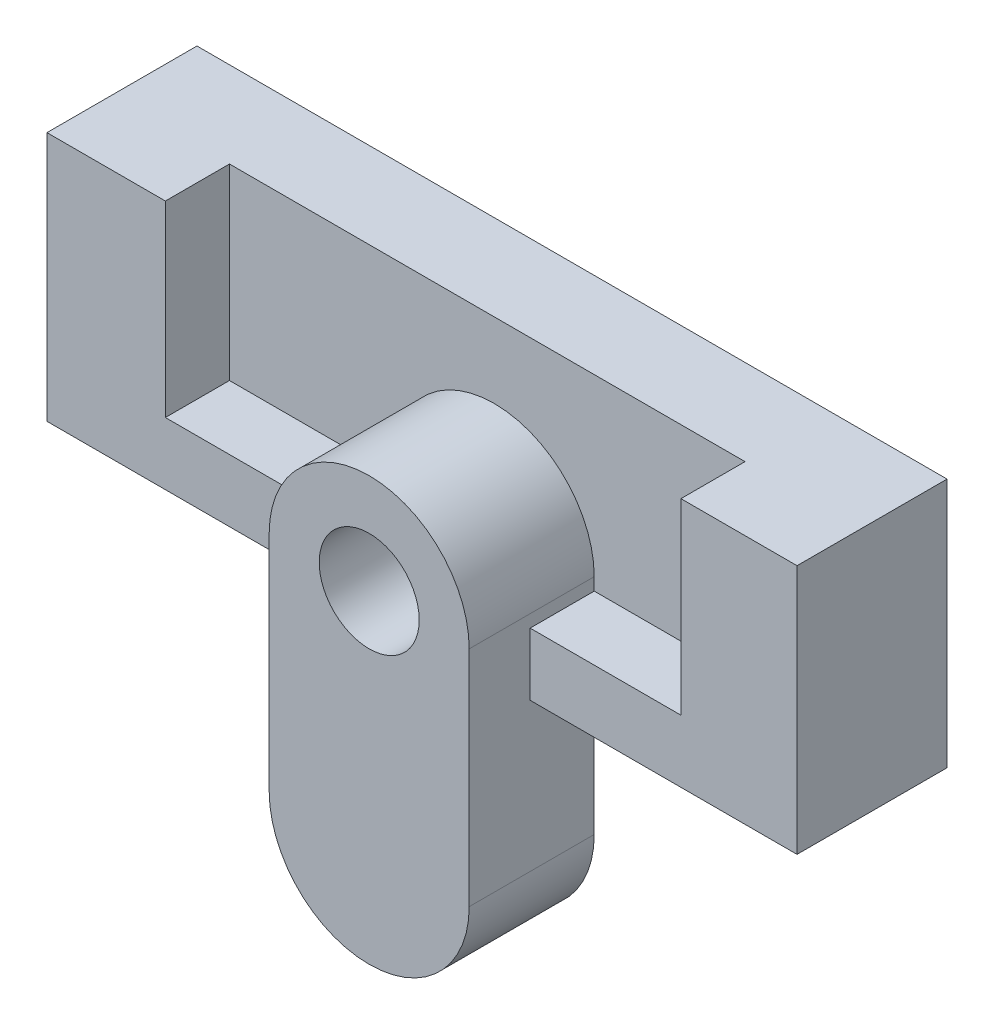
ISO-10303-21;
HEADER;
FILE_DESCRIPTION(('STEP AP214'),'2;1');
FILE_NAME('part.step','',(''),(''),'','','');
FILE_SCHEMA(('AUTOMOTIVE_DESIGN { 1 0 10303 214 1 1 1 1 }'));
ENDSEC;
DATA;
#1=APPLICATION_CONTEXT('core data for automotive mechanical design processes');
#2=APPLICATION_PROTOCOL_DEFINITION('international standard','automotive_design',2000,#1);
#3=PRODUCT_CONTEXT('',#1,'mechanical');
#4=PRODUCT('Part','Part','',(#3));
#5=PRODUCT_RELATED_PRODUCT_CATEGORY('part','',(#4));
#6=PRODUCT_DEFINITION_FORMATION('','',#4);
#7=PRODUCT_DEFINITION_CONTEXT('part definition',#1,'design');
#8=PRODUCT_DEFINITION('design','',#6,#7);
#9=PRODUCT_DEFINITION_SHAPE('','',#8);
#10=(LENGTH_UNIT() NAMED_UNIT(*) SI_UNIT(.MILLI.,.METRE.));
#11=(NAMED_UNIT(*) PLANE_ANGLE_UNIT() SI_UNIT($,.RADIAN.));
#12=(NAMED_UNIT(*) SI_UNIT($,.STERADIAN.) SOLID_ANGLE_UNIT());
#13=UNCERTAINTY_MEASURE_WITH_UNIT(LENGTH_MEASURE(1.E-05),#10,'distance_accuracy_value','');
#14=(GEOMETRIC_REPRESENTATION_CONTEXT(3) GLOBAL_UNCERTAINTY_ASSIGNED_CONTEXT((#13)) GLOBAL_UNIT_ASSIGNED_CONTEXT((#10,
#11,#12)) REPRESENTATION_CONTEXT('',''));
#15=CARTESIAN_POINT('',(0.,0.,0.));
#16=DIRECTION('',(0.,0.,1.));
#17=DIRECTION('',(1.,0.,0.));
#18=AXIS2_PLACEMENT_3D('',#15,#16,#17);
#19=CARTESIAN_POINT('',(-21.1764705882353,20.,-5.8513931888545));
#20=DIRECTION('',(0.,0.,-1.));
#21=DIRECTION('',(-1.,0.,0.));
#22=AXIS2_PLACEMENT_3D('',#19,#20,#21);
#23=PLANE('',#22);
#24=CARTESIAN_POINT('',(0.,6.,-5.8513931888545));
#25=DIRECTION('',(0.,0.,1.));
#26=DIRECTION('',(1.,0.,0.));
#27=AXIS2_PLACEMENT_3D('',#24,#25,#26);
#28=CIRCLE('',#27,8.);
#29=CARTESIAN_POINT('',(8.,6.,-5.8513931888545));
#30=VERTEX_POINT('',#29);
#31=CARTESIAN_POINT('',(-8.,6.,-5.8513931888545));
#32=VERTEX_POINT('',#31);
#33=EDGE_CURVE('E48',#30,#32,#28,.T.);
#34=ORIENTED_EDGE('',*,*,#33,.F.);
#35=DIRECTION('',(0.,-1.,0.));
#36=VECTOR('',#35,1.);
#37=CARTESIAN_POINT('',(8.,0.,-5.8513931888545));
#38=LINE('',#37,#36);
#39=CARTESIAN_POINT('',(8.,5.,-5.8513931888545));
#40=VERTEX_POINT('',#39);
#41=EDGE_CURVE('E152',#30,#40,#38,.T.);
#42=ORIENTED_EDGE('',*,*,#41,.T.);
#43=DIRECTION('',(-1.,0.,0.));
#44=VECTOR('',#43,1.);
#45=CARTESIAN_POINT('',(-21.1764705882353,5.,-5.8513931888545));
#46=LINE('',#45,#44);
#47=CARTESIAN_POINT('',(20.0619195046439,5.,-5.8513931888545));
#48=VERTEX_POINT('',#47);
#49=EDGE_CURVE('E211',#48,#40,#46,.T.);
#50=ORIENTED_EDGE('',*,*,#49,.F.);
#51=DIRECTION('',(0.,-1.,0.));
#52=VECTOR('',#51,1.);
#53=CARTESIAN_POINT('',(20.0619195046439,20.,-5.8513931888545));
#54=LINE('',#53,#52);
#55=CARTESIAN_POINT('',(20.0619195046439,20.,-5.8513931888545));
#56=VERTEX_POINT('',#55);
#57=EDGE_CURVE('E259',#56,#48,#54,.T.);
#58=ORIENTED_EDGE('',*,*,#57,.F.);
#59=DIRECTION('',(1.,0.,0.));
#60=VECTOR('',#59,1.);
#61=CARTESIAN_POINT('',(-21.1764705882353,20.,-5.8513931888545));
#62=LINE('',#61,#60);
#63=CARTESIAN_POINT('',(-21.1764705882353,20.,-5.8513931888545));
#64=VERTEX_POINT('',#63);
#65=EDGE_CURVE('E229',#64,#56,#62,.T.);
#66=ORIENTED_EDGE('',*,*,#65,.F.);
#67=DIRECTION('',(0.,-1.,0.));
#68=VECTOR('',#67,1.);
#69=CARTESIAN_POINT('',(-21.1764705882353,20.,-5.8513931888545));
#70=LINE('',#69,#68);
#71=CARTESIAN_POINT('',(-21.1764705882353,5.,-5.8513931888545));
#72=VERTEX_POINT('',#71);
#73=EDGE_CURVE('E256',#64,#72,#70,.T.);
#74=ORIENTED_EDGE('',*,*,#73,.T.);
#75=CARTESIAN_POINT('',(-8.,5.,-5.8513931888545));
#76=VERTEX_POINT('',#75);
#77=EDGE_CURVE('E210',#76,#72,#46,.T.);
#78=ORIENTED_EDGE('',*,*,#77,.F.);
#79=DIRECTION('',(0.,-1.,0.));
#80=VECTOR('',#79,1.);
#81=CARTESIAN_POINT('',(-8.,0.,-5.8513931888545));
#82=LINE('',#81,#80);
#83=EDGE_CURVE('E53',#32,#76,#82,.T.);
#84=ORIENTED_EDGE('',*,*,#83,.F.);
#85=EDGE_LOOP('',(#34,#42,#50,#58,#66,#74,#78,#84));
#86=FACE_BOUND('',#85,.T.);
#87=ADVANCED_FACE('F33',(#86),#23,.F.);
#88=CARTESIAN_POINT('',(-30.6501547987616,20.,-0.724458204334357));
#89=DIRECTION('',(0.,0.,-1.));
#90=DIRECTION('',(-1.,0.,0.));
#91=AXIS2_PLACEMENT_3D('',#88,#89,#90);
#92=PLANE('',#91);
#93=DIRECTION('',(1.,0.,0.));
#94=VECTOR('',#93,1.);
#95=CARTESIAN_POINT('',(-30.6501547987616,5.,-0.724458204334357));
#96=LINE('',#95,#94);
#97=CARTESIAN_POINT('',(7.99999999999998,5.,-0.724458204334357));
#98=VERTEX_POINT('',#97);
#99=CARTESIAN_POINT('',(20.0619195046439,5.,-0.724458204334357));
#100=VERTEX_POINT('',#99);
#101=EDGE_CURVE('E204',#98,#100,#96,.T.);
#102=ORIENTED_EDGE('',*,*,#101,.F.);
#103=DIRECTION('',(0.,-1.,0.));
#104=VECTOR('',#103,1.);
#105=CARTESIAN_POINT('',(8.,20.,-0.724458204334357));
#106=LINE('',#105,#104);
#107=CARTESIAN_POINT('',(7.99999999999998,0.,-0.724458204334357));
#108=VERTEX_POINT('',#107);
#109=EDGE_CURVE('E199',#98,#108,#106,.T.);
#110=ORIENTED_EDGE('',*,*,#109,.T.);
#111=DIRECTION('',(1.,0.,0.));
#112=VECTOR('',#111,1.);
#113=CARTESIAN_POINT('',(-30.6501547987616,0.,-0.724458204334357));
#114=LINE('',#113,#112);
#115=CARTESIAN_POINT('',(29.3498452012384,0.,-0.724458204334357));
#116=VERTEX_POINT('',#115);
#117=EDGE_CURVE('E243',#108,#116,#114,.T.);
#118=ORIENTED_EDGE('',*,*,#117,.T.);
#119=DIRECTION('',(0.,-1.,0.));
#120=VECTOR('',#119,1.);
#121=CARTESIAN_POINT('',(29.3498452012384,20.,-0.724458204334357));
#122=LINE('',#121,#120);
#123=CARTESIAN_POINT('',(29.3498452012384,20.,-0.724458204334357));
#124=VERTEX_POINT('',#123);
#125=EDGE_CURVE('E265',#124,#116,#122,.T.);
#126=ORIENTED_EDGE('',*,*,#125,.F.);
#127=DIRECTION('',(1.,0.,0.));
#128=VECTOR('',#127,1.);
#129=CARTESIAN_POINT('',(20.0619195046439,20.,-0.724458204334357));
#130=LINE('',#129,#128);
#131=CARTESIAN_POINT('',(20.0619195046439,20.,-0.724458204334357));
#132=VERTEX_POINT('',#131);
#133=EDGE_CURVE('E224',#132,#124,#130,.T.);
#134=ORIENTED_EDGE('',*,*,#133,.F.);
#135=DIRECTION('',(0.,-1.,0.));
#136=VECTOR('',#135,1.);
#137=CARTESIAN_POINT('',(20.0619195046439,20.,-0.724458204334357));
#138=LINE('',#137,#136);
#139=EDGE_CURVE('E262',#132,#100,#138,.T.);
#140=ORIENTED_EDGE('',*,*,#139,.T.);
#141=EDGE_LOOP('',(#102,#110,#118,#126,#134,#140));
#142=FACE_BOUND('',#141,.T.);
#143=ADVANCED_FACE('F321',(#142),#92,.F.);
#144=CARTESIAN_POINT('',(0.,5.,0.));
#145=DIRECTION('',(0.,-1.,0.));
#146=DIRECTION('',(0.,0.,-1.));
#147=AXIS2_PLACEMENT_3D('',#144,#145,#146);
#148=PLANE('',#147);
#149=DIRECTION('',(0.,0.,1.));
#150=VECTOR('',#149,1.);
#151=CARTESIAN_POINT('',(-8.,5.,0.));
#152=LINE('',#151,#150);
#153=CARTESIAN_POINT('',(-8.,5.,-0.724458204334357));
#154=VERTEX_POINT('',#153);
#155=EDGE_CURVE('E41',#76,#154,#152,.T.);
#156=ORIENTED_EDGE('',*,*,#155,.F.);
#157=ORIENTED_EDGE('',*,*,#77,.T.);
#158=DIRECTION('',(0.,0.,1.));
#159=VECTOR('',#158,1.);
#160=CARTESIAN_POINT('',(-21.1764705882353,5.,-0.724458204334357));
#161=LINE('',#160,#159);
#162=CARTESIAN_POINT('',(-21.1764705882353,5.,-0.724458204334357));
#163=VERTEX_POINT('',#162);
#164=EDGE_CURVE('E214',#72,#163,#161,.T.);
#165=ORIENTED_EDGE('',*,*,#164,.T.);
#166=EDGE_CURVE('E205',#163,#154,#96,.T.);
#167=ORIENTED_EDGE('',*,*,#166,.T.);
#168=EDGE_LOOP('',(#156,#157,#165,#167));
#169=FACE_BOUND('',#168,.T.);
#170=ADVANCED_FACE('F274',(#169),#148,.F.);
#171=ORIENTED_EDGE('',*,*,#49,.T.);
#172=DIRECTION('',(0.,0.,1.));
#173=VECTOR('',#172,1.);
#174=CARTESIAN_POINT('',(8.,5.,0.));
#175=LINE('',#174,#173);
#176=EDGE_CURVE('E11',#40,#98,#175,.T.);
#177=ORIENTED_EDGE('',*,*,#176,.T.);
#178=ORIENTED_EDGE('',*,*,#101,.T.);
#179=DIRECTION('',(0.,0.,1.));
#180=VECTOR('',#179,1.);
#181=CARTESIAN_POINT('',(20.0619195046439,5.,-0.724458204334357));
#182=LINE('',#181,#180);
#183=EDGE_CURVE('E207',#48,#100,#182,.T.);
#184=ORIENTED_EDGE('',*,*,#183,.F.);
#185=EDGE_LOOP('',(#171,#177,#178,#184));
#186=FACE_BOUND('',#185,.T.);
#187=ADVANCED_FACE('F353',(#186),#148,.F.);
#188=CARTESIAN_POINT('',(-21.1764705882353,20.,-0.724458204334357));
#189=DIRECTION('',(-1.,0.,0.));
#190=DIRECTION('',(0.,0.,1.));
#191=AXIS2_PLACEMENT_3D('',#188,#189,#190);
#192=PLANE('',#191);
#193=ORIENTED_EDGE('',*,*,#164,.F.);
#194=ORIENTED_EDGE('',*,*,#73,.F.);
#195=DIRECTION('',(0.,0.,-1.));
#196=VECTOR('',#195,1.);
#197=CARTESIAN_POINT('',(-21.1764705882353,20.,-0.724458204334357));
#198=LINE('',#197,#196);
#199=CARTESIAN_POINT('',(-21.1764705882353,20.,-0.724458204334357));
#200=VERTEX_POINT('',#199);
#201=EDGE_CURVE('E231',#200,#64,#198,.T.);
#202=ORIENTED_EDGE('',*,*,#201,.F.);
#203=DIRECTION('',(0.,-1.,0.));
#204=VECTOR('',#203,1.);
#205=CARTESIAN_POINT('',(-21.1764705882353,20.,-0.724458204334357));
#206=LINE('',#205,#204);
#207=EDGE_CURVE('E253',#200,#163,#206,.T.);
#208=ORIENTED_EDGE('',*,*,#207,.T.);
#209=EDGE_LOOP('',(#193,#194,#202,#208));
#210=FACE_BOUND('',#209,.T.);
#211=ADVANCED_FACE('F282',(#210),#192,.F.);
#212=CARTESIAN_POINT('',(20.0619195046439,20.,-0.724458204334357));
#213=DIRECTION('',(-1.,0.,0.));
#214=DIRECTION('',(0.,0.,1.));
#215=AXIS2_PLACEMENT_3D('',#212,#213,#214);
#216=PLANE('',#215);
#217=ORIENTED_EDGE('',*,*,#57,.T.);
#218=ORIENTED_EDGE('',*,*,#183,.T.);
#219=ORIENTED_EDGE('',*,*,#139,.F.);
#220=DIRECTION('',(0.,0.,-1.));
#221=VECTOR('',#220,1.);
#222=CARTESIAN_POINT('',(20.0619195046439,20.,-0.724458204334357));
#223=LINE('',#222,#221);
#224=EDGE_CURVE('E226',#132,#56,#223,.T.);
#225=ORIENTED_EDGE('',*,*,#224,.T.);
#226=EDGE_LOOP('',(#217,#218,#219,#225));
#227=FACE_BOUND('',#226,.T.);
#228=ADVANCED_FACE('F330',(#227),#216,.T.);
#229=CARTESIAN_POINT('',(-30.6501547987616,20.,-12.7244582043344));
#230=DIRECTION('',(0.,0.,-1.));
#231=DIRECTION('',(-1.,0.,0.));
#232=AXIS2_PLACEMENT_3D('',#229,#230,#231);
#233=PLANE('',#232);
#234=CARTESIAN_POINT('',(0.,6.,-12.7244582043344));
#235=DIRECTION('',(0.,0.,1.));
#236=DIRECTION('',(1.,0.,0.));
#237=AXIS2_PLACEMENT_3D('',#234,#235,#236);
#238=CIRCLE('',#237,4.);
#239=CARTESIAN_POINT('',(4.,6.,-12.7244582043344));
#240=VERTEX_POINT('',#239);
#241=EDGE_CURVE('E175',#240,#240,#238,.T.);
#242=ORIENTED_EDGE('',*,*,#241,.T.);
#243=EDGE_LOOP('',(#242));
#244=FACE_BOUND('',#243,.T.);
#245=DIRECTION('',(1.,0.,0.));
#246=VECTOR('',#245,1.);
#247=CARTESIAN_POINT('',(-30.6501547987616,0.,-12.7244582043344));
#248=LINE('',#247,#246);
#249=CARTESIAN_POINT('',(-30.6501547987616,0.,-12.7244582043344));
#250=VERTEX_POINT('',#249);
#251=CARTESIAN_POINT('',(29.3498452012384,0.,-12.7244582043344));
#252=VERTEX_POINT('',#251);
#253=EDGE_CURVE('E216',#250,#252,#248,.T.);
#254=ORIENTED_EDGE('',*,*,#253,.F.);
#255=DIRECTION('',(0.,-1.,0.));
#256=VECTOR('',#255,1.);
#257=CARTESIAN_POINT('',(-30.6501547987616,20.,-12.7244582043344));
#258=LINE('',#257,#256);
#259=CARTESIAN_POINT('',(-30.6501547987616,20.,-12.7244582043344));
#260=VERTEX_POINT('',#259);
#261=EDGE_CURVE('E249',#260,#250,#258,.T.);
#262=ORIENTED_EDGE('',*,*,#261,.F.);
#263=DIRECTION('',(1.,0.,0.));
#264=VECTOR('',#263,1.);
#265=CARTESIAN_POINT('',(-30.6501547987616,20.,-12.7244582043344));
#266=LINE('',#265,#264);
#267=CARTESIAN_POINT('',(29.3498452012384,20.,-12.7244582043344));
#268=VERTEX_POINT('',#267);
#269=EDGE_CURVE('E217',#260,#268,#266,.T.);
#270=ORIENTED_EDGE('',*,*,#269,.T.);
#271=DIRECTION('',(0.,-1.,0.));
#272=VECTOR('',#271,1.);
#273=CARTESIAN_POINT('',(29.3498452012384,20.,-12.7244582043344));
#274=LINE('',#273,#272);
#275=EDGE_CURVE('E237',#268,#252,#274,.T.);
#276=ORIENTED_EDGE('',*,*,#275,.T.);
#277=EDGE_LOOP('',(#254,#262,#270,#276));
#278=FACE_BOUND('',#277,.T.);
#279=ADVANCED_FACE('F35',(#244,#278),#233,.T.);
#280=CARTESIAN_POINT('',(-30.6501547987616,20.,-12.7244582043344));
#281=DIRECTION('',(1.,0.,0.));
#282=DIRECTION('',(0.,0.,-1.));
#283=AXIS2_PLACEMENT_3D('',#280,#281,#282);
#284=PLANE('',#283);
#285=DIRECTION('',(0.,0.,1.));
#286=VECTOR('',#285,1.);
#287=CARTESIAN_POINT('',(-30.6501547987616,0.,-12.7244582043344));
#288=LINE('',#287,#286);
#289=CARTESIAN_POINT('',(-30.6501547987616,0.,-0.724458204334357));
#290=VERTEX_POINT('',#289);
#291=EDGE_CURVE('E221',#250,#290,#288,.T.);
#292=ORIENTED_EDGE('',*,*,#291,.T.);
#293=DIRECTION('',(0.,-1.,0.));
#294=VECTOR('',#293,1.);
#295=CARTESIAN_POINT('',(-30.6501547987616,20.,-0.724458204334357));
#296=LINE('',#295,#294);
#297=CARTESIAN_POINT('',(-30.6501547987616,20.,-0.724458204334357));
#298=VERTEX_POINT('',#297);
#299=EDGE_CURVE('E251',#298,#290,#296,.T.);
#300=ORIENTED_EDGE('',*,*,#299,.F.);
#301=DIRECTION('',(0.,0.,1.));
#302=VECTOR('',#301,1.);
#303=CARTESIAN_POINT('',(-30.6501547987616,20.,-12.7244582043344));
#304=LINE('',#303,#302);
#305=EDGE_CURVE('E235',#260,#298,#304,.T.);
#306=ORIENTED_EDGE('',*,*,#305,.F.);
#307=ORIENTED_EDGE('',*,*,#261,.T.);
#308=EDGE_LOOP('',(#292,#300,#306,#307));
#309=FACE_BOUND('',#308,.T.);
#310=ADVANCED_FACE('F342',(#309),#284,.F.);
#311=DIRECTION('',(0.,-1.,0.));
#312=VECTOR('',#311,1.);
#313=CARTESIAN_POINT('',(-8.00000000000001,20.,-0.724458204334357));
#314=LINE('',#313,#312);
#315=CARTESIAN_POINT('',(-8.,0.,-0.724458204334357));
#316=VERTEX_POINT('',#315);
#317=EDGE_CURVE('E194',#154,#316,#314,.T.);
#318=ORIENTED_EDGE('',*,*,#317,.F.);
#319=ORIENTED_EDGE('',*,*,#166,.F.);
#320=ORIENTED_EDGE('',*,*,#207,.F.);
#321=DIRECTION('',(1.,0.,0.));
#322=VECTOR('',#321,1.);
#323=CARTESIAN_POINT('',(-30.6501547987616,20.,-0.724458204334357));
#324=LINE('',#323,#322);
#325=EDGE_CURVE('E233',#298,#200,#324,.T.);
#326=ORIENTED_EDGE('',*,*,#325,.F.);
#327=ORIENTED_EDGE('',*,*,#299,.T.);
#328=EDGE_CURVE('E244',#290,#316,#114,.T.);
#329=ORIENTED_EDGE('',*,*,#328,.T.);
#330=EDGE_LOOP('',(#318,#319,#320,#326,#327,#329));
#331=FACE_BOUND('',#330,.T.);
#332=ADVANCED_FACE('F285',(#331),#92,.F.);
#333=CARTESIAN_POINT('',(29.3498452012384,20.,-12.7244582043344));
#334=DIRECTION('',(1.,0.,0.));
#335=DIRECTION('',(0.,0.,-1.));
#336=AXIS2_PLACEMENT_3D('',#333,#334,#335);
#337=PLANE('',#336);
#338=DIRECTION('',(0.,0.,1.));
#339=VECTOR('',#338,1.);
#340=CARTESIAN_POINT('',(29.3498452012384,0.,-12.7244582043344));
#341=LINE('',#340,#339);
#342=EDGE_CURVE('E240',#252,#116,#341,.T.);
#343=ORIENTED_EDGE('',*,*,#342,.F.);
#344=ORIENTED_EDGE('',*,*,#275,.F.);
#345=DIRECTION('',(0.,0.,1.));
#346=VECTOR('',#345,1.);
#347=CARTESIAN_POINT('',(29.3498452012384,20.,-12.7244582043344));
#348=LINE('',#347,#346);
#349=EDGE_CURVE('E220',#268,#124,#348,.T.);
#350=ORIENTED_EDGE('',*,*,#349,.T.);
#351=ORIENTED_EDGE('',*,*,#125,.T.);
#352=EDGE_LOOP('',(#343,#344,#350,#351));
#353=FACE_BOUND('',#352,.T.);
#354=ADVANCED_FACE('F333',(#353),#337,.T.);
#355=CARTESIAN_POINT('',(0.,20.,0.));
#356=DIRECTION('',(0.,-1.,0.));
#357=DIRECTION('',(0.,0.,-1.));
#358=AXIS2_PLACEMENT_3D('',#355,#356,#357);
#359=PLANE('',#358);
#360=ORIENTED_EDGE('',*,*,#269,.F.);
#361=ORIENTED_EDGE('',*,*,#305,.T.);
#362=ORIENTED_EDGE('',*,*,#325,.T.);
#363=ORIENTED_EDGE('',*,*,#201,.T.);
#364=ORIENTED_EDGE('',*,*,#65,.T.);
#365=ORIENTED_EDGE('',*,*,#224,.F.);
#366=ORIENTED_EDGE('',*,*,#133,.T.);
#367=ORIENTED_EDGE('',*,*,#349,.F.);
#368=EDGE_LOOP('',(#360,#361,#362,#363,#364,#365,#366,#367));
#369=FACE_BOUND('',#368,.T.);
#370=ADVANCED_FACE('F316',(#369),#359,.F.);
#371=CARTESIAN_POINT('',(0.,0.,0.));
#372=DIRECTION('',(0.,-1.,0.));
#373=DIRECTION('',(0.,0.,-1.));
#374=AXIS2_PLACEMENT_3D('',#371,#372,#373);
#375=PLANE('',#374);
#376=DIRECTION('',(0.,0.,1.));
#377=VECTOR('',#376,1.);
#378=CARTESIAN_POINT('',(8.,0.,0.));
#379=LINE('',#378,#377);
#380=CARTESIAN_POINT('',(8.,0.,-5.8513931888545));
#381=VERTEX_POINT('',#380);
#382=EDGE_CURVE('E201',#381,#108,#379,.T.);
#383=ORIENTED_EDGE('',*,*,#382,.F.);
#384=DIRECTION('',(-1.,0.,0.));
#385=VECTOR('',#384,1.);
#386=CARTESIAN_POINT('',(0.,0.,-5.8513931888545));
#387=LINE('',#386,#385);
#388=CARTESIAN_POINT('',(-8.,0.,-5.8513931888545));
#389=VERTEX_POINT('',#388);
#390=EDGE_CURVE('E154',#381,#389,#387,.T.);
#391=ORIENTED_EDGE('',*,*,#390,.T.);
#392=DIRECTION('',(0.,0.,1.));
#393=VECTOR('',#392,1.);
#394=CARTESIAN_POINT('',(-8.,0.,0.));
#395=LINE('',#394,#393);
#396=EDGE_CURVE('E197',#389,#316,#395,.T.);
#397=ORIENTED_EDGE('',*,*,#396,.T.);
#398=ORIENTED_EDGE('',*,*,#328,.F.);
#399=ORIENTED_EDGE('',*,*,#291,.F.);
#400=ORIENTED_EDGE('',*,*,#253,.T.);
#401=ORIENTED_EDGE('',*,*,#342,.T.);
#402=ORIENTED_EDGE('',*,*,#117,.F.);
#403=EDGE_LOOP('',(#383,#391,#397,#398,#399,#400,#401,#402));
#404=FACE_BOUND('',#403,.T.);
#405=ADVANCED_FACE('F291',(#404),#375,.T.);
#406=CARTESIAN_POINT('',(0.,6.,4.1486068111455));
#407=DIRECTION('',(0.,0.,-1.));
#408=DIRECTION('',(-1.,0.,0.));
#409=AXIS2_PLACEMENT_3D('',#406,#407,#408);
#410=CYLINDRICAL_SURFACE('',#409,4.);
#411=CARTESIAN_POINT('',(0.,6.,4.1486068111455));
#412=DIRECTION('',(0.,0.,1.));
#413=DIRECTION('',(1.,0.,0.));
#414=AXIS2_PLACEMENT_3D('',#411,#412,#413);
#415=CIRCLE('',#414,4.);
#416=CARTESIAN_POINT('',(4.,6.,4.1486068111455));
#417=VERTEX_POINT('',#416);
#418=EDGE_CURVE('E179',#417,#417,#415,.T.);
#419=ORIENTED_EDGE('',*,*,#418,.T.);
#420=EDGE_LOOP('',(#419));
#421=FACE_BOUND('',#420,.T.);
#422=ORIENTED_EDGE('',*,*,#241,.F.);
#423=EDGE_LOOP('',(#422));
#424=FACE_BOUND('',#423,.T.);
#425=ADVANCED_FACE('F307',(#421,#424),#410,.F.);
#426=CARTESIAN_POINT('',(8.,0.,4.1486068111455));
#427=DIRECTION('',(1.,0.,0.));
#428=DIRECTION('',(0.,1.,0.));
#429=AXIS2_PLACEMENT_3D('',#426,#427,#428);
#430=PLANE('',#429);
#431=CARTESIAN_POINT('',(8.,-11.8586326767091,-5.8513931888545));
#432=VERTEX_POINT('',#431);
#433=EDGE_CURVE('E184',#381,#432,#38,.T.);
#434=ORIENTED_EDGE('',*,*,#433,.F.);
#435=ORIENTED_EDGE('',*,*,#382,.T.);
#436=ORIENTED_EDGE('',*,*,#109,.F.);
#437=ORIENTED_EDGE('',*,*,#176,.F.);
#438=ORIENTED_EDGE('',*,*,#41,.F.);
#439=DIRECTION('',(0.,0.,-1.));
#440=VECTOR('',#439,1.);
#441=CARTESIAN_POINT('',(8.,6.,4.1486068111455));
#442=LINE('',#441,#440);
#443=CARTESIAN_POINT('',(8.,6.,4.1486068111455));
#444=VERTEX_POINT('',#443);
#445=EDGE_CURVE('E144',#444,#30,#442,.T.);
#446=ORIENTED_EDGE('',*,*,#445,.F.);
#447=DIRECTION('',(0.,-1.,0.));
#448=VECTOR('',#447,1.);
#449=CARTESIAN_POINT('',(8.,0.,4.1486068111455));
#450=LINE('',#449,#448);
#451=CARTESIAN_POINT('',(8.,-11.8586326767091,4.1486068111455));
#452=VERTEX_POINT('',#451);
#453=EDGE_CURVE('E150',#444,#452,#450,.T.);
#454=ORIENTED_EDGE('',*,*,#453,.T.);
#455=DIRECTION('',(0.,0.,-1.));
#456=VECTOR('',#455,1.);
#457=CARTESIAN_POINT('',(8.,-11.8586326767091,4.1486068111455));
#458=LINE('',#457,#456);
#459=EDGE_CURVE('E182',#452,#432,#458,.T.);
#460=ORIENTED_EDGE('',*,*,#459,.T.);
#461=EDGE_LOOP('',(#434,#435,#436,#437,#438,#446,#454,#460));
#462=FACE_BOUND('',#461,.T.);
#463=ADVANCED_FACE('F147',(#462),#430,.T.);
#464=CARTESIAN_POINT('',(0.,6.,4.1486068111455));
#465=DIRECTION('',(0.,0.,-1.));
#466=DIRECTION('',(-1.,0.,0.));
#467=AXIS2_PLACEMENT_3D('',#464,#465,#466);
#468=CYLINDRICAL_SURFACE('',#467,8.);
#469=ORIENTED_EDGE('',*,*,#33,.T.);
#470=DIRECTION('',(0.,0.,-1.));
#471=VECTOR('',#470,1.);
#472=CARTESIAN_POINT('',(-8.,6.,4.1486068111455));
#473=LINE('',#472,#471);
#474=CARTESIAN_POINT('',(-8.,6.,4.1486068111455));
#475=VERTEX_POINT('',#474);
#476=EDGE_CURVE('E155',#475,#32,#473,.T.);
#477=ORIENTED_EDGE('',*,*,#476,.F.);
#478=CARTESIAN_POINT('',(0.,6.,4.1486068111455));
#479=DIRECTION('',(0.,0.,1.));
#480=DIRECTION('',(1.,0.,0.));
#481=AXIS2_PLACEMENT_3D('',#478,#479,#480);
#482=CIRCLE('',#481,8.);
#483=EDGE_CURVE('E158',#444,#475,#482,.T.);
#484=ORIENTED_EDGE('',*,*,#483,.F.);
#485=ORIENTED_EDGE('',*,*,#445,.T.);
#486=EDGE_LOOP('',(#469,#477,#484,#485));
#487=FACE_BOUND('',#486,.T.);
#488=ADVANCED_FACE('F159',(#487),#468,.T.);
#489=CARTESIAN_POINT('',(-8.,0.,4.1486068111455));
#490=DIRECTION('',(1.,0.,0.));
#491=DIRECTION('',(0.,1.,0.));
#492=AXIS2_PLACEMENT_3D('',#489,#490,#491);
#493=PLANE('',#492);
#494=ORIENTED_EDGE('',*,*,#396,.F.);
#495=CARTESIAN_POINT('',(-7.99999999999999,-11.8586326767091,-5.8513931888545));
#496=VERTEX_POINT('',#495);
#497=EDGE_CURVE('E186',#389,#496,#82,.T.);
#498=ORIENTED_EDGE('',*,*,#497,.T.);
#499=DIRECTION('',(0.,0.,-1.));
#500=VECTOR('',#499,1.);
#501=CARTESIAN_POINT('',(-7.99999999999999,-11.8586326767091,4.1486068111455));
#502=LINE('',#501,#500);
#503=CARTESIAN_POINT('',(-7.99999999999999,-11.8586326767091,4.1486068111455));
#504=VERTEX_POINT('',#503);
#505=EDGE_CURVE('E189',#504,#496,#502,.T.);
#506=ORIENTED_EDGE('',*,*,#505,.F.);
#507=DIRECTION('',(0.,-1.,0.));
#508=VECTOR('',#507,1.);
#509=CARTESIAN_POINT('',(-8.,0.,4.1486068111455));
#510=LINE('',#509,#508);
#511=EDGE_CURVE('E163',#475,#504,#510,.T.);
#512=ORIENTED_EDGE('',*,*,#511,.F.);
#513=ORIENTED_EDGE('',*,*,#476,.T.);
#514=ORIENTED_EDGE('',*,*,#83,.T.);
#515=ORIENTED_EDGE('',*,*,#155,.T.);
#516=ORIENTED_EDGE('',*,*,#317,.T.);
#517=EDGE_LOOP('',(#494,#498,#506,#512,#513,#514,#515,#516));
#518=FACE_BOUND('',#517,.T.);
#519=ADVANCED_FACE('F271',(#518),#493,.F.);
#520=CARTESIAN_POINT('',(0.,-11.8586326767091,4.1486068111455));
#521=DIRECTION('',(0.,0.,-1.));
#522=DIRECTION('',(-1.,0.,0.));
#523=AXIS2_PLACEMENT_3D('',#520,#521,#522);
#524=CYLINDRICAL_SURFACE('',#523,7.99999999999999);
#525=CARTESIAN_POINT('',(0.,-11.8586326767091,-5.8513931888545));
#526=DIRECTION('',(0.,0.,1.));
#527=DIRECTION('',(1.,0.,0.));
#528=AXIS2_PLACEMENT_3D('',#525,#526,#527);
#529=CIRCLE('',#528,7.99999999999999);
#530=EDGE_CURVE('E170',#496,#432,#529,.T.);
#531=ORIENTED_EDGE('',*,*,#530,.T.);
#532=ORIENTED_EDGE('',*,*,#459,.F.);
#533=CARTESIAN_POINT('',(0.,-11.8586326767091,4.1486068111455));
#534=DIRECTION('',(0.,0.,1.));
#535=DIRECTION('',(1.,0.,0.));
#536=AXIS2_PLACEMENT_3D('',#533,#534,#535);
#537=CIRCLE('',#536,7.99999999999999);
#538=EDGE_CURVE('E168',#504,#452,#537,.T.);
#539=ORIENTED_EDGE('',*,*,#538,.F.);
#540=ORIENTED_EDGE('',*,*,#505,.T.);
#541=EDGE_LOOP('',(#531,#532,#539,#540));
#542=FACE_BOUND('',#541,.T.);
#543=ADVANCED_FACE('F300',(#542),#524,.T.);
#544=CARTESIAN_POINT('',(0.,0.,4.1486068111455));
#545=DIRECTION('',(0.,0.,1.));
#546=DIRECTION('',(1.,0.,0.));
#547=AXIS2_PLACEMENT_3D('',#544,#545,#546);
#548=PLANE('',#547);
#549=ORIENTED_EDGE('',*,*,#453,.F.);
#550=ORIENTED_EDGE('',*,*,#483,.T.);
#551=ORIENTED_EDGE('',*,*,#511,.T.);
#552=ORIENTED_EDGE('',*,*,#538,.T.);
#553=EDGE_LOOP('',(#549,#550,#551,#552));
#554=FACE_BOUND('',#553,.T.);
#555=ORIENTED_EDGE('',*,*,#418,.F.);
#556=EDGE_LOOP('',(#555));
#557=FACE_BOUND('',#556,.T.);
#558=ADVANCED_FACE('F165',(#554,#557),#548,.T.);
#559=CARTESIAN_POINT('',(0.,0.,-5.8513931888545));
#560=DIRECTION('',(0.,0.,1.));
#561=DIRECTION('',(1.,0.,0.));
#562=AXIS2_PLACEMENT_3D('',#559,#560,#561);
#563=PLANE('',#562);
#564=ORIENTED_EDGE('',*,*,#390,.F.);
#565=ORIENTED_EDGE('',*,*,#433,.T.);
#566=ORIENTED_EDGE('',*,*,#530,.F.);
#567=ORIENTED_EDGE('',*,*,#497,.F.);
#568=EDGE_LOOP('',(#564,#565,#566,#567));
#569=FACE_BOUND('',#568,.T.);
#570=ADVANCED_FACE('F298',(#569),#563,.F.);
#571=CLOSED_SHELL('',(#87,#143,#170,#187,#211,#228,#279,#310,#332,#354,#370,#405,#425,#463,#488,
#519,#543,#558,#570));
#572=MANIFOLD_SOLID_BREP('B2',#571);
#573=ADVANCED_BREP_SHAPE_REPRESENTATION('',(#18,#572),#14);
#574=SHAPE_DEFINITION_REPRESENTATION(#9,#573);
ENDSEC;
END-ISO-10303-21;
